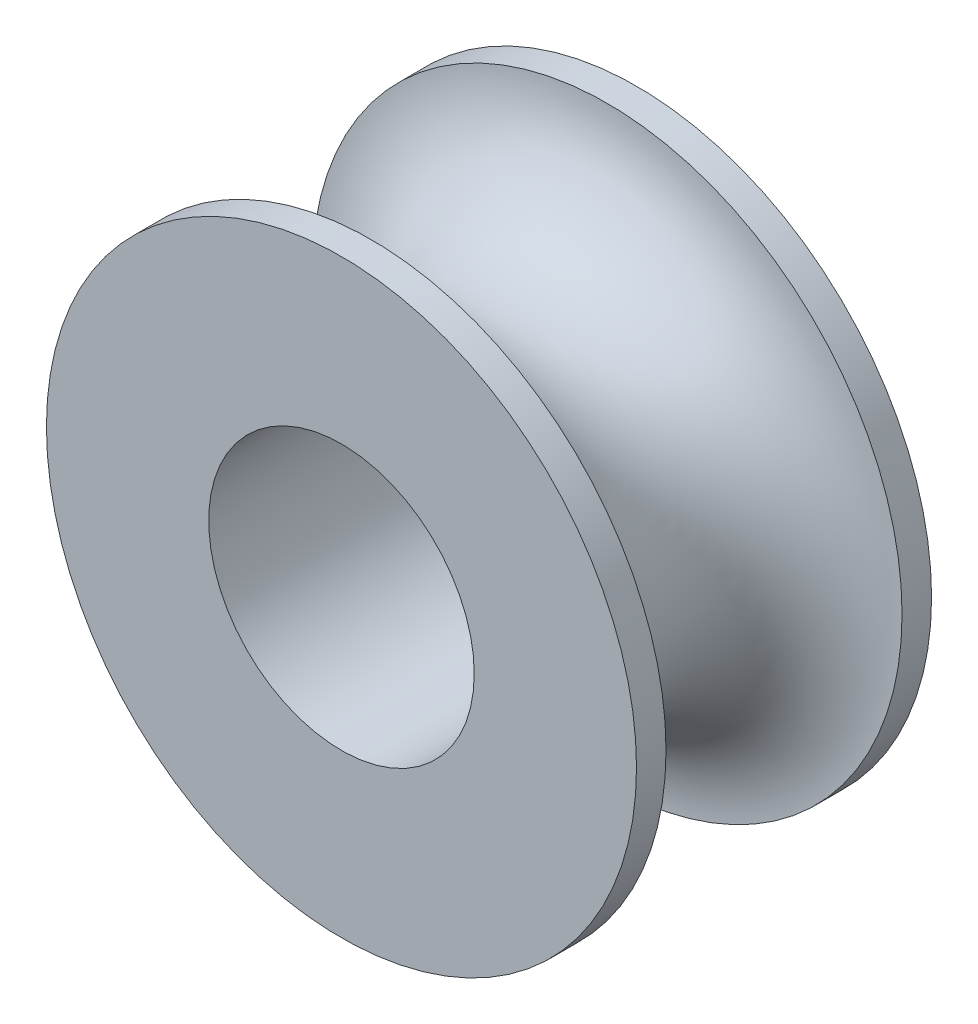
ISO-10303-21;
HEADER;
FILE_DESCRIPTION(('STEP AP214'),'2;1');
FILE_NAME('part.step','',(''),(''),'','','');
FILE_SCHEMA(('AUTOMOTIVE_DESIGN { 1 0 10303 214 1 1 1 1 }'));
ENDSEC;
DATA;
#1=APPLICATION_CONTEXT('core data for automotive mechanical design processes');
#2=APPLICATION_PROTOCOL_DEFINITION('international standard','automotive_design',2000,#1);
#3=PRODUCT_CONTEXT('',#1,'mechanical');
#4=PRODUCT('Part','Part','',(#3));
#5=PRODUCT_RELATED_PRODUCT_CATEGORY('part','',(#4));
#6=PRODUCT_DEFINITION_FORMATION('','',#4);
#7=PRODUCT_DEFINITION_CONTEXT('part definition',#1,'design');
#8=PRODUCT_DEFINITION('design','',#6,#7);
#9=PRODUCT_DEFINITION_SHAPE('','',#8);
#10=(LENGTH_UNIT() NAMED_UNIT(*) SI_UNIT(.MILLI.,.METRE.));
#11=(NAMED_UNIT(*) PLANE_ANGLE_UNIT() SI_UNIT($,.RADIAN.));
#12=(NAMED_UNIT(*) SI_UNIT($,.STERADIAN.) SOLID_ANGLE_UNIT());
#13=UNCERTAINTY_MEASURE_WITH_UNIT(LENGTH_MEASURE(1.E-05),#10,'distance_accuracy_value','');
#14=(GEOMETRIC_REPRESENTATION_CONTEXT(3) GLOBAL_UNCERTAINTY_ASSIGNED_CONTEXT((#13)) GLOBAL_UNIT_ASSIGNED_CONTEXT((#10,
#11,#12)) REPRESENTATION_CONTEXT('',''));
#15=CARTESIAN_POINT('',(0.,0.,0.));
#16=DIRECTION('',(0.,0.,1.));
#17=DIRECTION('',(1.,0.,0.));
#18=AXIS2_PLACEMENT_3D('',#15,#16,#17);
#19=CARTESIAN_POINT('',(0.,0.,-2.75));
#20=DIRECTION('',(0.,0.,-1.));
#21=DIRECTION('',(-1.,0.,0.));
#22=AXIS2_PLACEMENT_3D('',#19,#20,#21);
#23=CYLINDRICAL_SURFACE('',#22,5.);
#24=CARTESIAN_POINT('',(0.,0.,-2.5));
#25=DIRECTION('',(0.,0.,-1.));
#26=DIRECTION('',(-1.,0.,0.));
#27=AXIS2_PLACEMENT_3D('',#24,#25,#26);
#28=CIRCLE('',#27,5.);
#29=CARTESIAN_POINT('',(-5.,0.,-2.5));
#30=VERTEX_POINT('',#29);
#31=EDGE_CURVE('E54',#30,#30,#28,.T.);
#32=ORIENTED_EDGE('',*,*,#31,.F.);
#33=EDGE_LOOP('',(#32));
#34=FACE_BOUND('',#33,.T.);
#35=CARTESIAN_POINT('',(0.,0.,-2.));
#36=DIRECTION('',(0.,0.,-1.));
#37=DIRECTION('',(-1.,0.,0.));
#38=AXIS2_PLACEMENT_3D('',#35,#36,#37);
#39=CIRCLE('',#38,5.);
#40=CARTESIAN_POINT('',(-5.,0.,-2.));
#41=VERTEX_POINT('',#40);
#42=EDGE_CURVE('E10',#41,#41,#39,.T.);
#43=ORIENTED_EDGE('',*,*,#42,.T.);
#44=EDGE_LOOP('',(#43));
#45=FACE_BOUND('',#44,.T.);
#46=ADVANCED_FACE('F37',(#34,#45),#23,.T.);
#47=CARTESIAN_POINT('',(0.,0.,0.));
#48=DIRECTION('',(0.,0.,-1.));
#49=DIRECTION('',(-1.,0.,0.));
#50=AXIS2_PLACEMENT_3D('',#47,#48,#49);
#51=TOROIDAL_SURFACE('',#50,5.,2.);
#52=ORIENTED_EDGE('',*,*,#42,.F.);
#53=EDGE_LOOP('',(#52));
#54=FACE_BOUND('',#53,.T.);
#55=CARTESIAN_POINT('',(0.,0.,2.));
#56=DIRECTION('',(0.,0.,-1.));
#57=DIRECTION('',(-1.,0.,0.));
#58=AXIS2_PLACEMENT_3D('',#55,#56,#57);
#59=CIRCLE('',#58,5.);
#60=CARTESIAN_POINT('',(-5.,0.,2.));
#61=VERTEX_POINT('',#60);
#62=EDGE_CURVE('E44',#61,#61,#59,.T.);
#63=ORIENTED_EDGE('',*,*,#62,.T.);
#64=EDGE_LOOP('',(#63));
#65=FACE_BOUND('',#64,.T.);
#66=ADVANCED_FACE('F80',(#54,#65),#51,.F.);
#67=CARTESIAN_POINT('',(0.,0.,-2.75));
#68=DIRECTION('',(0.,0.,-1.));
#69=DIRECTION('',(-1.,0.,0.));
#70=AXIS2_PLACEMENT_3D('',#67,#68,#69);
#71=CYLINDRICAL_SURFACE('',#70,5.);
#72=ORIENTED_EDGE('',*,*,#62,.F.);
#73=EDGE_LOOP('',(#72));
#74=FACE_BOUND('',#73,.T.);
#75=CARTESIAN_POINT('',(0.,0.,2.5));
#76=DIRECTION('',(0.,0.,-1.));
#77=DIRECTION('',(-1.,0.,0.));
#78=AXIS2_PLACEMENT_3D('',#75,#76,#77);
#79=CIRCLE('',#78,5.);
#80=CARTESIAN_POINT('',(-5.,0.,2.5));
#81=VERTEX_POINT('',#80);
#82=EDGE_CURVE('E49',#81,#81,#79,.T.);
#83=ORIENTED_EDGE('',*,*,#82,.T.);
#84=EDGE_LOOP('',(#83));
#85=FACE_BOUND('',#84,.T.);
#86=ADVANCED_FACE('F75',(#74,#85),#71,.T.);
#87=CARTESIAN_POINT('',(0.,0.,2.5));
#88=DIRECTION('',(0.,0.,-1.));
#89=DIRECTION('',(-1.,0.,0.));
#90=AXIS2_PLACEMENT_3D('',#87,#88,#89);
#91=PLANE('',#90);
#92=CARTESIAN_POINT('',(0.,0.,2.5));
#93=DIRECTION('',(0.,0.,1.));
#94=DIRECTION('',(1.,0.,0.));
#95=AXIS2_PLACEMENT_3D('',#92,#93,#94);
#96=CIRCLE('',#95,2.25);
#97=CARTESIAN_POINT('',(2.25,0.,2.5));
#98=VERTEX_POINT('',#97);
#99=EDGE_CURVE('E64',#98,#98,#96,.T.);
#100=ORIENTED_EDGE('',*,*,#99,.F.);
#101=EDGE_LOOP('',(#100));
#102=FACE_BOUND('',#101,.T.);
#103=ORIENTED_EDGE('',*,*,#82,.F.);
#104=EDGE_LOOP('',(#103));
#105=FACE_BOUND('',#104,.T.);
#106=ADVANCED_FACE('F71',(#102,#105),#91,.F.);
#107=CARTESIAN_POINT('',(0.,0.,-2.5));
#108=DIRECTION('',(0.,0.,1.));
#109=DIRECTION('',(1.,0.,0.));
#110=AXIS2_PLACEMENT_3D('',#107,#108,#109);
#111=PLANE('',#110);
#112=CARTESIAN_POINT('',(0.,0.,-2.5));
#113=DIRECTION('',(0.,0.,1.));
#114=DIRECTION('',(1.,0.,0.));
#115=AXIS2_PLACEMENT_3D('',#112,#113,#114);
#116=CIRCLE('',#115,2.25);
#117=CARTESIAN_POINT('',(2.25,0.,-2.5));
#118=VERTEX_POINT('',#117);
#119=EDGE_CURVE('E60',#118,#118,#116,.T.);
#120=ORIENTED_EDGE('',*,*,#119,.T.);
#121=EDGE_LOOP('',(#120));
#122=FACE_BOUND('',#121,.T.);
#123=ORIENTED_EDGE('',*,*,#31,.T.);
#124=EDGE_LOOP('',(#123));
#125=FACE_BOUND('',#124,.T.);
#126=ADVANCED_FACE('F74',(#122,#125),#111,.F.);
#127=CARTESIAN_POINT('',(0.,0.,-2.5));
#128=DIRECTION('',(0.,0.,1.));
#129=DIRECTION('',(1.,0.,0.));
#130=AXIS2_PLACEMENT_3D('',#127,#128,#129);
#131=CYLINDRICAL_SURFACE('',#130,2.25);
#132=ORIENTED_EDGE('',*,*,#119,.F.);
#133=EDGE_LOOP('',(#132));
#134=FACE_BOUND('',#133,.T.);
#135=ORIENTED_EDGE('',*,*,#99,.T.);
#136=EDGE_LOOP('',(#135));
#137=FACE_BOUND('',#136,.T.);
#138=ADVANCED_FACE('F69',(#134,#137),#131,.F.);
#139=CLOSED_SHELL('',(#46,#66,#86,#106,#126,#138));
#140=MANIFOLD_SOLID_BREP('B2',#139);
#141=ADVANCED_BREP_SHAPE_REPRESENTATION('',(#18,#140),#14);
#142=SHAPE_DEFINITION_REPRESENTATION(#9,#141);
ENDSEC;
END-ISO-10303-21;
